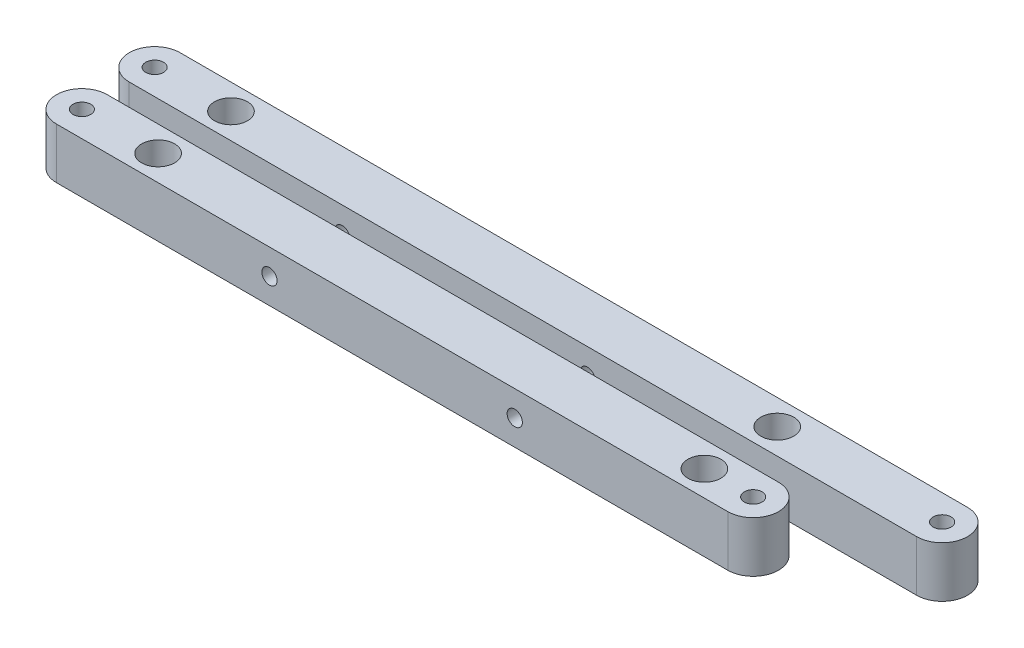
ISO-10303-21;
HEADER;
FILE_DESCRIPTION(('STEP AP214'),'2;1');
FILE_NAME('part.step','',(''),(''),'','','');
FILE_SCHEMA(('AUTOMOTIVE_DESIGN { 1 0 10303 214 1 1 1 1 }'));
ENDSEC;
DATA;
#1=APPLICATION_CONTEXT('core data for automotive mechanical design processes');
#2=APPLICATION_PROTOCOL_DEFINITION('international standard','automotive_design',2000,#1);
#3=PRODUCT_CONTEXT('',#1,'mechanical');
#4=PRODUCT('Part','Part','',(#3));
#5=PRODUCT_RELATED_PRODUCT_CATEGORY('part','',(#4));
#6=PRODUCT_DEFINITION_FORMATION('','',#4);
#7=PRODUCT_DEFINITION_CONTEXT('part definition',#1,'design');
#8=PRODUCT_DEFINITION('design','',#6,#7);
#9=PRODUCT_DEFINITION_SHAPE('','',#8);
#10=(LENGTH_UNIT() NAMED_UNIT(*) SI_UNIT(.MILLI.,.METRE.));
#11=(NAMED_UNIT(*) PLANE_ANGLE_UNIT() SI_UNIT($,.RADIAN.));
#12=(NAMED_UNIT(*) SI_UNIT($,.STERADIAN.) SOLID_ANGLE_UNIT());
#13=UNCERTAINTY_MEASURE_WITH_UNIT(LENGTH_MEASURE(1.E-05),#10,'distance_accuracy_value','');
#14=(GEOMETRIC_REPRESENTATION_CONTEXT(3) GLOBAL_UNCERTAINTY_ASSIGNED_CONTEXT((#13)) GLOBAL_UNIT_ASSIGNED_CONTEXT((#10,
#11,#12)) REPRESENTATION_CONTEXT('',''));
#15=CARTESIAN_POINT('',(0.,0.,0.));
#16=DIRECTION('',(0.,0.,1.));
#17=DIRECTION('',(1.,0.,0.));
#18=AXIS2_PLACEMENT_3D('',#15,#16,#17);
#19=CARTESIAN_POINT('',(31.9517119667802,10.,0.527341983870526));
#20=DIRECTION('',(0.,-1.,0.));
#21=DIRECTION('',(0.,0.,-1.));
#22=AXIS2_PLACEMENT_3D('',#19,#20,#21);
#23=CYLINDRICAL_SURFACE('',#22,1.75000000000001);
#24=CARTESIAN_POINT('',(31.9517119667802,0.,0.527341983870526));
#25=DIRECTION('',(0.,1.,0.));
#26=DIRECTION('',(0.,0.,1.));
#27=AXIS2_PLACEMENT_3D('',#24,#25,#26);
#28=CIRCLE('',#27,1.75000000000001);
#29=CARTESIAN_POINT('',(31.9517119667802,0.,2.27734198387054));
#30=VERTEX_POINT('',#29);
#31=EDGE_CURVE('E165',#30,#30,#28,.T.);
#32=ORIENTED_EDGE('',*,*,#31,.F.);
#33=EDGE_LOOP('',(#32));
#34=FACE_BOUND('',#33,.T.);
#35=CARTESIAN_POINT('',(31.9517119667802,2.,0.527341983870526));
#36=DIRECTION('',(0.,1.,0.));
#37=DIRECTION('',(0.,0.,1.));
#38=AXIS2_PLACEMENT_3D('',#35,#36,#37);
#39=CIRCLE('',#38,1.75000000000001);
#40=CARTESIAN_POINT('',(31.9517119667802,2.,2.27734198387054));
#41=VERTEX_POINT('',#40);
#42=EDGE_CURVE('E52',#41,#41,#39,.T.);
#43=ORIENTED_EDGE('',*,*,#42,.T.);
#44=EDGE_LOOP('',(#43));
#45=FACE_BOUND('',#44,.T.);
#46=ADVANCED_FACE('F48',(#34,#45),#23,.F.);
#47=CARTESIAN_POINT('',(139.43171196678,10.,0.527341983870526));
#48=DIRECTION('',(0.,-1.,0.));
#49=DIRECTION('',(0.,0.,-1.));
#50=AXIS2_PLACEMENT_3D('',#47,#48,#49);
#51=CYLINDRICAL_SURFACE('',#50,1.75000000000001);
#52=CARTESIAN_POINT('',(139.43171196678,0.,0.527341983870526));
#53=DIRECTION('',(0.,1.,0.));
#54=DIRECTION('',(0.,0.,1.));
#55=AXIS2_PLACEMENT_3D('',#52,#53,#54);
#56=CIRCLE('',#55,1.75000000000001);
#57=CARTESIAN_POINT('',(139.43171196678,0.,2.27734198387054));
#58=VERTEX_POINT('',#57);
#59=EDGE_CURVE('E160',#58,#58,#56,.T.);
#60=ORIENTED_EDGE('',*,*,#59,.F.);
#61=EDGE_LOOP('',(#60));
#62=FACE_BOUND('',#61,.T.);
#63=CARTESIAN_POINT('',(139.43171196678,2.,0.527341983870526));
#64=DIRECTION('',(0.,1.,0.));
#65=DIRECTION('',(0.,0.,1.));
#66=AXIS2_PLACEMENT_3D('',#63,#64,#65);
#67=CIRCLE('',#66,1.75000000000001);
#68=CARTESIAN_POINT('',(139.43171196678,2.,2.27734198387054));
#69=VERTEX_POINT('',#68);
#70=EDGE_CURVE('E132',#69,#69,#67,.T.);
#71=ORIENTED_EDGE('',*,*,#70,.T.);
#72=EDGE_LOOP('',(#71));
#73=FACE_BOUND('',#72,.T.);
#74=ADVANCED_FACE('F196',(#62,#73),#51,.F.);
#75=CARTESIAN_POINT('',(16.9517119667802,10.,0.527341983870526));
#76=DIRECTION('',(0.,1.,0.));
#77=DIRECTION('',(0.,0.,1.));
#78=AXIS2_PLACEMENT_3D('',#75,#76,#77);
#79=PLANE('',#78);
#80=CARTESIAN_POINT('',(31.9517119667802,10.,0.527341983870526));
#81=DIRECTION('',(0.,1.,0.));
#82=DIRECTION('',(0.,0.,1.));
#83=AXIS2_PLACEMENT_3D('',#80,#81,#82);
#84=CIRCLE('',#83,3.25);
#85=CARTESIAN_POINT('',(31.9517119667802,10.,3.77734198387053));
#86=VERTEX_POINT('',#85);
#87=EDGE_CURVE('E140',#86,#86,#84,.T.);
#88=ORIENTED_EDGE('',*,*,#87,.F.);
#89=EDGE_LOOP('',(#88));
#90=FACE_BOUND('',#89,.T.);
#91=CARTESIAN_POINT('',(139.43171196678,10.,0.527341983870526));
#92=DIRECTION('',(0.,1.,0.));
#93=DIRECTION('',(0.,0.,1.));
#94=AXIS2_PLACEMENT_3D('',#91,#92,#93);
#95=CIRCLE('',#94,3.25000000000001);
#96=CARTESIAN_POINT('',(139.43171196678,10.,3.77734198387053));
#97=VERTEX_POINT('',#96);
#98=EDGE_CURVE('E150',#97,#97,#95,.T.);
#99=ORIENTED_EDGE('',*,*,#98,.F.);
#100=EDGE_LOOP('',(#99));
#101=FACE_BOUND('',#100,.T.);
#102=CARTESIAN_POINT('',(16.9517119667802,10.,0.527341983870526));
#103=DIRECTION('',(0.,1.,0.));
#104=DIRECTION('',(0.,0.,1.));
#105=AXIS2_PLACEMENT_3D('',#102,#103,#104);
#106=CIRCLE('',#105,1.75000000000001);
#107=CARTESIAN_POINT('',(16.9517119667802,10.,2.27734198387053));
#108=VERTEX_POINT('',#107);
#109=EDGE_CURVE('E119',#108,#108,#106,.T.);
#110=ORIENTED_EDGE('',*,*,#109,.F.);
#111=EDGE_LOOP('',(#110));
#112=FACE_BOUND('',#111,.T.);
#113=CARTESIAN_POINT('',(16.9517119667802,10.,0.527341983870526));
#114=DIRECTION('',(0.,1.,0.));
#115=DIRECTION('',(0.,0.,1.));
#116=AXIS2_PLACEMENT_3D('',#113,#114,#115);
#117=CIRCLE('',#116,5.);
#118=CARTESIAN_POINT('',(16.9517119667802,10.,-4.47265801612947));
#119=VERTEX_POINT('',#118);
#120=CARTESIAN_POINT('',(16.9517119667802,10.,5.52734198387053));
#121=VERTEX_POINT('',#120);
#122=EDGE_CURVE('E103',#119,#121,#117,.T.);
#123=ORIENTED_EDGE('',*,*,#122,.T.);
#124=DIRECTION('',(1.,0.,0.));
#125=VECTOR('',#124,1.);
#126=CARTESIAN_POINT('',(149.03171196678,10.,5.52734198387053));
#127=LINE('',#126,#125);
#128=CARTESIAN_POINT('',(149.03171196678,10.,5.52734198387053));
#129=VERTEX_POINT('',#128);
#130=EDGE_CURVE('E97',#121,#129,#127,.T.);
#131=ORIENTED_EDGE('',*,*,#130,.T.);
#132=CARTESIAN_POINT('',(149.03171196678,10.,0.527341983870526));
#133=DIRECTION('',(0.,1.,0.));
#134=DIRECTION('',(0.,0.,-1.));
#135=AXIS2_PLACEMENT_3D('',#132,#133,#134);
#136=CIRCLE('',#135,5.);
#137=CARTESIAN_POINT('',(149.031711966781,10.,-4.47265801612947));
#138=VERTEX_POINT('',#137);
#139=EDGE_CURVE('E101',#129,#138,#136,.T.);
#140=ORIENTED_EDGE('',*,*,#139,.T.);
#141=DIRECTION('',(-1.,0.,0.));
#142=VECTOR('',#141,1.);
#143=CARTESIAN_POINT('',(16.9517119667802,10.,-4.47265801612947));
#144=LINE('',#143,#142);
#145=EDGE_CURVE('E67',#138,#119,#144,.T.);
#146=ORIENTED_EDGE('',*,*,#145,.T.);
#147=EDGE_LOOP('',(#123,#131,#140,#146));
#148=FACE_BOUND('',#147,.T.);
#149=CARTESIAN_POINT('',(149.03171196678,10.,0.527341983870526));
#150=DIRECTION('',(0.,1.,0.));
#151=DIRECTION('',(0.,0.,1.));
#152=AXIS2_PLACEMENT_3D('',#149,#150,#151);
#153=CIRCLE('',#152,1.75000000000001);
#154=CARTESIAN_POINT('',(149.03171196678,10.,2.27734198387054));
#155=VERTEX_POINT('',#154);
#156=EDGE_CURVE('E157',#155,#155,#153,.T.);
#157=ORIENTED_EDGE('',*,*,#156,.F.);
#158=EDGE_LOOP('',(#157));
#159=FACE_BOUND('',#158,.T.);
#160=ADVANCED_FACE('F98',(#90,#101,#112,#148,#159),#79,.T.);
#161=CARTESIAN_POINT('',(16.9517119667802,0.,0.527341983870526));
#162=DIRECTION('',(0.,1.,0.));
#163=DIRECTION('',(0.,0.,1.));
#164=AXIS2_PLACEMENT_3D('',#161,#162,#163);
#165=PLANE('',#164);
#166=CARTESIAN_POINT('',(16.9517119667802,0.,0.527341983870526));
#167=DIRECTION('',(0.,1.,0.));
#168=DIRECTION('',(0.,0.,1.));
#169=AXIS2_PLACEMENT_3D('',#166,#167,#168);
#170=CIRCLE('',#169,5.);
#171=CARTESIAN_POINT('',(16.9517119667802,0.,-4.47265801612947));
#172=VERTEX_POINT('',#171);
#173=CARTESIAN_POINT('',(16.9517119667802,0.,5.52734198387053));
#174=VERTEX_POINT('',#173);
#175=EDGE_CURVE('E116',#172,#174,#170,.T.);
#176=ORIENTED_EDGE('',*,*,#175,.F.);
#177=DIRECTION('',(-1.,0.,0.));
#178=VECTOR('',#177,1.);
#179=CARTESIAN_POINT('',(16.9517119667802,0.,-4.47265801612947));
#180=LINE('',#179,#178);
#181=CARTESIAN_POINT('',(149.031711966781,0.,-4.47265801612947));
#182=VERTEX_POINT('',#181);
#183=EDGE_CURVE('E90',#182,#172,#180,.T.);
#184=ORIENTED_EDGE('',*,*,#183,.F.);
#185=CARTESIAN_POINT('',(149.03171196678,0.,0.527341983870526));
#186=DIRECTION('',(0.,1.,0.));
#187=DIRECTION('',(0.,0.,-1.));
#188=AXIS2_PLACEMENT_3D('',#185,#186,#187);
#189=CIRCLE('',#188,5.);
#190=CARTESIAN_POINT('',(149.03171196678,0.,5.52734198387053));
#191=VERTEX_POINT('',#190);
#192=EDGE_CURVE('E84',#191,#182,#189,.T.);
#193=ORIENTED_EDGE('',*,*,#192,.F.);
#194=DIRECTION('',(1.,0.,0.));
#195=VECTOR('',#194,1.);
#196=CARTESIAN_POINT('',(149.03171196678,0.,5.52734198387053));
#197=LINE('',#196,#195);
#198=EDGE_CURVE('E107',#174,#191,#197,.T.);
#199=ORIENTED_EDGE('',*,*,#198,.F.);
#200=EDGE_LOOP('',(#176,#184,#193,#199));
#201=FACE_BOUND('',#200,.T.);
#202=CARTESIAN_POINT('',(16.9517119667802,0.,0.527341983870526));
#203=DIRECTION('',(0.,1.,0.));
#204=DIRECTION('',(0.,0.,1.));
#205=AXIS2_PLACEMENT_3D('',#202,#203,#204);
#206=CIRCLE('',#205,1.75000000000001);
#207=CARTESIAN_POINT('',(16.9517119667802,0.,2.27734198387053));
#208=VERTEX_POINT('',#207);
#209=EDGE_CURVE('E168',#208,#208,#206,.T.);
#210=ORIENTED_EDGE('',*,*,#209,.T.);
#211=EDGE_LOOP('',(#210));
#212=FACE_BOUND('',#211,.T.);
#213=ORIENTED_EDGE('',*,*,#31,.T.);
#214=EDGE_LOOP('',(#213));
#215=FACE_BOUND('',#214,.T.);
#216=ORIENTED_EDGE('',*,*,#59,.T.);
#217=EDGE_LOOP('',(#216));
#218=FACE_BOUND('',#217,.T.);
#219=CARTESIAN_POINT('',(149.03171196678,0.,0.527341983870526));
#220=DIRECTION('',(0.,1.,0.));
#221=DIRECTION('',(0.,0.,1.));
#222=AXIS2_PLACEMENT_3D('',#219,#220,#221);
#223=CIRCLE('',#222,1.75000000000001);
#224=CARTESIAN_POINT('',(149.03171196678,0.,2.27734198387054));
#225=VERTEX_POINT('',#224);
#226=EDGE_CURVE('E131',#225,#225,#223,.T.);
#227=ORIENTED_EDGE('',*,*,#226,.T.);
#228=EDGE_LOOP('',(#227));
#229=FACE_BOUND('',#228,.T.);
#230=ADVANCED_FACE('F174',(#201,#212,#215,#218,#229),#165,.F.);
#231=CARTESIAN_POINT('',(16.9517119667802,10.,0.527341983870526));
#232=DIRECTION('',(0.,-1.,0.));
#233=DIRECTION('',(0.,0.,-1.));
#234=AXIS2_PLACEMENT_3D('',#231,#232,#233);
#235=CYLINDRICAL_SURFACE('',#234,5.);
#236=ORIENTED_EDGE('',*,*,#175,.T.);
#237=DIRECTION('',(0.,-1.,0.));
#238=VECTOR('',#237,1.);
#239=CARTESIAN_POINT('',(16.9517119667802,10.,5.52734198387053));
#240=LINE('',#239,#238);
#241=EDGE_CURVE('E12',#121,#174,#240,.T.);
#242=ORIENTED_EDGE('',*,*,#241,.F.);
#243=ORIENTED_EDGE('',*,*,#122,.F.);
#244=DIRECTION('',(0.,-1.,0.));
#245=VECTOR('',#244,1.);
#246=CARTESIAN_POINT('',(16.9517119667802,10.,-4.47265801612947));
#247=LINE('',#246,#245);
#248=EDGE_CURVE('E112',#119,#172,#247,.T.);
#249=ORIENTED_EDGE('',*,*,#248,.T.);
#250=EDGE_LOOP('',(#236,#242,#243,#249));
#251=FACE_BOUND('',#250,.T.);
#252=ADVANCED_FACE('F50',(#251),#235,.T.);
#253=CARTESIAN_POINT('',(149.03171196678,10.,5.52734198387053));
#254=DIRECTION('',(0.,0.,-1.));
#255=DIRECTION('',(-1.,0.,0.));
#256=AXIS2_PLACEMENT_3D('',#253,#254,#255);
#257=PLANE('',#256);
#258=CARTESIAN_POINT('',(58.86171196678,5.,5.52734198387053));
#259=DIRECTION('',(0.,0.,1.));
#260=DIRECTION('',(1.,0.,0.));
#261=AXIS2_PLACEMENT_3D('',#258,#259,#260);
#262=CIRCLE('',#261,1.5);
#263=CARTESIAN_POINT('',(60.36171196678,5.,5.52734198387053));
#264=VERTEX_POINT('',#263);
#265=EDGE_CURVE('E129',#264,#264,#262,.T.);
#266=ORIENTED_EDGE('',*,*,#265,.F.);
#267=EDGE_LOOP('',(#266));
#268=FACE_BOUND('',#267,.T.);
#269=CARTESIAN_POINT('',(107.12171196678,5.00000000000001,5.52734198387053));
#270=DIRECTION('',(0.,0.,1.));
#271=DIRECTION('',(1.,0.,0.));
#272=AXIS2_PLACEMENT_3D('',#269,#270,#271);
#273=CIRCLE('',#272,1.5);
#274=CARTESIAN_POINT('',(108.62171196678,5.00000000000001,5.52734198387053));
#275=VERTEX_POINT('',#274);
#276=EDGE_CURVE('E138',#275,#275,#273,.T.);
#277=ORIENTED_EDGE('',*,*,#276,.F.);
#278=EDGE_LOOP('',(#277));
#279=FACE_BOUND('',#278,.T.);
#280=ORIENTED_EDGE('',*,*,#198,.T.);
#281=DIRECTION('',(0.,-1.,0.));
#282=VECTOR('',#281,1.);
#283=CARTESIAN_POINT('',(149.03171196678,10.,5.52734198387053));
#284=LINE('',#283,#282);
#285=EDGE_CURVE('E58',#129,#191,#284,.T.);
#286=ORIENTED_EDGE('',*,*,#285,.F.);
#287=ORIENTED_EDGE('',*,*,#130,.F.);
#288=ORIENTED_EDGE('',*,*,#241,.T.);
#289=EDGE_LOOP('',(#280,#286,#287,#288));
#290=FACE_BOUND('',#289,.T.);
#291=ADVANCED_FACE('F106',(#268,#279,#290),#257,.F.);
#292=CARTESIAN_POINT('',(149.03171196678,10.,0.527341983870526));
#293=DIRECTION('',(0.,-1.,0.));
#294=DIRECTION('',(0.,0.,-1.));
#295=AXIS2_PLACEMENT_3D('',#292,#293,#294);
#296=CYLINDRICAL_SURFACE('',#295,5.);
#297=ORIENTED_EDGE('',*,*,#192,.T.);
#298=DIRECTION('',(0.,-1.,0.));
#299=VECTOR('',#298,1.);
#300=CARTESIAN_POINT('',(149.031711966781,10.,-4.47265801612947));
#301=LINE('',#300,#299);
#302=EDGE_CURVE('E108',#138,#182,#301,.T.);
#303=ORIENTED_EDGE('',*,*,#302,.F.);
#304=ORIENTED_EDGE('',*,*,#139,.F.);
#305=ORIENTED_EDGE('',*,*,#285,.T.);
#306=EDGE_LOOP('',(#297,#303,#304,#305));
#307=FACE_BOUND('',#306,.T.);
#308=ADVANCED_FACE('F110',(#307),#296,.T.);
#309=CARTESIAN_POINT('',(16.9517119667802,10.,-4.47265801612947));
#310=DIRECTION('',(0.,0.,1.));
#311=DIRECTION('',(1.,0.,0.));
#312=AXIS2_PLACEMENT_3D('',#309,#310,#311);
#313=PLANE('',#312);
#314=CARTESIAN_POINT('',(58.86171196678,5.,-4.47265801612947));
#315=DIRECTION('',(0.,0.,1.));
#316=DIRECTION('',(1.,0.,0.));
#317=AXIS2_PLACEMENT_3D('',#314,#315,#316);
#318=CIRCLE('',#317,1.5);
#319=CARTESIAN_POINT('',(60.36171196678,5.,-4.47265801612947));
#320=VERTEX_POINT('',#319);
#321=EDGE_CURVE('E128',#320,#320,#318,.T.);
#322=ORIENTED_EDGE('',*,*,#321,.T.);
#323=EDGE_LOOP('',(#322));
#324=FACE_BOUND('',#323,.T.);
#325=CARTESIAN_POINT('',(107.12171196678,5.00000000000001,-4.47265801612947));
#326=DIRECTION('',(0.,0.,1.));
#327=DIRECTION('',(1.,0.,0.));
#328=AXIS2_PLACEMENT_3D('',#325,#326,#327);
#329=CIRCLE('',#328,1.5);
#330=CARTESIAN_POINT('',(108.62171196678,5.00000000000001,-4.47265801612947));
#331=VERTEX_POINT('',#330);
#332=EDGE_CURVE('E125',#331,#331,#329,.T.);
#333=ORIENTED_EDGE('',*,*,#332,.T.);
#334=EDGE_LOOP('',(#333));
#335=FACE_BOUND('',#334,.T.);
#336=ORIENTED_EDGE('',*,*,#183,.T.);
#337=ORIENTED_EDGE('',*,*,#248,.F.);
#338=ORIENTED_EDGE('',*,*,#145,.F.);
#339=ORIENTED_EDGE('',*,*,#302,.T.);
#340=EDGE_LOOP('',(#336,#337,#338,#339));
#341=FACE_BOUND('',#340,.T.);
#342=ADVANCED_FACE('F180',(#324,#335,#341),#313,.F.);
#343=CARTESIAN_POINT('',(16.9517119667802,10.,0.527341983870526));
#344=DIRECTION('',(0.,-1.,0.));
#345=DIRECTION('',(0.,0.,-1.));
#346=AXIS2_PLACEMENT_3D('',#343,#344,#345);
#347=CYLINDRICAL_SURFACE('',#346,1.75000000000001);
#348=ORIENTED_EDGE('',*,*,#109,.T.);
#349=EDGE_LOOP('',(#348));
#350=FACE_BOUND('',#349,.T.);
#351=ORIENTED_EDGE('',*,*,#209,.F.);
#352=EDGE_LOOP('',(#351));
#353=FACE_BOUND('',#352,.T.);
#354=ADVANCED_FACE('F177',(#350,#353),#347,.F.);
#355=CARTESIAN_POINT('',(149.03171196678,10.,0.527341983870526));
#356=DIRECTION('',(0.,-1.,0.));
#357=DIRECTION('',(0.,0.,-1.));
#358=AXIS2_PLACEMENT_3D('',#355,#356,#357);
#359=CYLINDRICAL_SURFACE('',#358,1.75000000000001);
#360=ORIENTED_EDGE('',*,*,#156,.T.);
#361=EDGE_LOOP('',(#360));
#362=FACE_BOUND('',#361,.T.);
#363=ORIENTED_EDGE('',*,*,#226,.F.);
#364=EDGE_LOOP('',(#363));
#365=FACE_BOUND('',#364,.T.);
#366=ADVANCED_FACE('F179',(#362,#365),#359,.F.);
#367=CARTESIAN_POINT('',(107.12171196678,5.00000000000001,-18.7915450649919));
#368=DIRECTION('',(0.,0.,1.));
#369=DIRECTION('',(1.,0.,0.));
#370=AXIS2_PLACEMENT_3D('',#367,#368,#369);
#371=CYLINDRICAL_SURFACE('',#370,1.5);
#372=ORIENTED_EDGE('',*,*,#276,.T.);
#373=EDGE_LOOP('',(#372));
#374=FACE_BOUND('',#373,.T.);
#375=ORIENTED_EDGE('',*,*,#332,.F.);
#376=EDGE_LOOP('',(#375));
#377=FACE_BOUND('',#376,.T.);
#378=ADVANCED_FACE('F187',(#374,#377),#371,.F.);
#379=CARTESIAN_POINT('',(58.86171196678,5.,-18.7915450649919));
#380=DIRECTION('',(0.,0.,1.));
#381=DIRECTION('',(1.,0.,0.));
#382=AXIS2_PLACEMENT_3D('',#379,#380,#381);
#383=CYLINDRICAL_SURFACE('',#382,1.5);
#384=ORIENTED_EDGE('',*,*,#265,.T.);
#385=EDGE_LOOP('',(#384));
#386=FACE_BOUND('',#385,.T.);
#387=ORIENTED_EDGE('',*,*,#321,.F.);
#388=EDGE_LOOP('',(#387));
#389=FACE_BOUND('',#388,.T.);
#390=ADVANCED_FACE('F209',(#386,#389),#383,.F.);
#391=CARTESIAN_POINT('',(139.43171196678,2.,0.527341983870526));
#392=DIRECTION('',(0.,1.,0.));
#393=DIRECTION('',(0.,0.,1.));
#394=AXIS2_PLACEMENT_3D('',#391,#392,#393);
#395=CYLINDRICAL_SURFACE('',#394,3.25000000000001);
#396=CARTESIAN_POINT('',(139.43171196678,2.,0.527341983870526));
#397=DIRECTION('',(0.,1.,0.));
#398=DIRECTION('',(0.,0.,1.));
#399=AXIS2_PLACEMENT_3D('',#396,#397,#398);
#400=CIRCLE('',#399,3.25000000000001);
#401=CARTESIAN_POINT('',(139.43171196678,2.,3.77734198387053));
#402=VERTEX_POINT('',#401);
#403=EDGE_CURVE('E145',#402,#402,#400,.T.);
#404=ORIENTED_EDGE('',*,*,#403,.F.);
#405=EDGE_LOOP('',(#404));
#406=FACE_BOUND('',#405,.T.);
#407=ORIENTED_EDGE('',*,*,#98,.T.);
#408=EDGE_LOOP('',(#407));
#409=FACE_BOUND('',#408,.T.);
#410=ADVANCED_FACE('F213',(#406,#409),#395,.F.);
#411=CARTESIAN_POINT('',(139.43171196678,2.,0.527341983870526));
#412=DIRECTION('',(0.,1.,0.));
#413=DIRECTION('',(0.,0.,1.));
#414=AXIS2_PLACEMENT_3D('',#411,#412,#413);
#415=PLANE('',#414);
#416=ORIENTED_EDGE('',*,*,#70,.F.);
#417=EDGE_LOOP('',(#416));
#418=FACE_BOUND('',#417,.T.);
#419=ORIENTED_EDGE('',*,*,#403,.T.);
#420=EDGE_LOOP('',(#419));
#421=FACE_BOUND('',#420,.T.);
#422=ADVANCED_FACE('F217',(#418,#421),#415,.T.);
#423=CARTESIAN_POINT('',(31.9517119667802,2.,0.527341983870526));
#424=DIRECTION('',(0.,1.,0.));
#425=DIRECTION('',(0.,0.,1.));
#426=AXIS2_PLACEMENT_3D('',#423,#424,#425);
#427=CYLINDRICAL_SURFACE('',#426,3.25);
#428=CARTESIAN_POINT('',(31.9517119667802,2.,0.527341983870526));
#429=DIRECTION('',(0.,1.,0.));
#430=DIRECTION('',(0.,0.,1.));
#431=AXIS2_PLACEMENT_3D('',#428,#429,#430);
#432=CIRCLE('',#431,3.25);
#433=CARTESIAN_POINT('',(31.9517119667802,2.,3.77734198387053));
#434=VERTEX_POINT('',#433);
#435=EDGE_CURVE('E134',#434,#434,#432,.T.);
#436=ORIENTED_EDGE('',*,*,#435,.F.);
#437=EDGE_LOOP('',(#436));
#438=FACE_BOUND('',#437,.T.);
#439=ORIENTED_EDGE('',*,*,#87,.T.);
#440=EDGE_LOOP('',(#439));
#441=FACE_BOUND('',#440,.T.);
#442=ADVANCED_FACE('F221',(#438,#441),#427,.F.);
#443=CARTESIAN_POINT('',(31.9517119667802,2.,0.527341983870526));
#444=DIRECTION('',(0.,1.,0.));
#445=DIRECTION('',(0.,0.,1.));
#446=AXIS2_PLACEMENT_3D('',#443,#444,#445);
#447=PLANE('',#446);
#448=ORIENTED_EDGE('',*,*,#42,.F.);
#449=EDGE_LOOP('',(#448));
#450=FACE_BOUND('',#449,.T.);
#451=ORIENTED_EDGE('',*,*,#435,.T.);
#452=EDGE_LOOP('',(#451));
#453=FACE_BOUND('',#452,.T.);
#454=ADVANCED_FACE('F225',(#450,#453),#447,.T.);
#455=CLOSED_SHELL('',(#46,#74,#160,#230,#252,#291,#308,#342,#354,#366,#378,#390,#410,#422,#442,#454));
#456=MANIFOLD_SOLID_BREP('B2',#455);
#457=CARTESIAN_POINT('',(31.9517119667803,10.,-13.8102971641873));
#458=DIRECTION('',(0.,-1.,0.));
#459=DIRECTION('',(0.,0.,-1.));
#460=AXIS2_PLACEMENT_3D('',#457,#458,#459);
#461=CYLINDRICAL_SURFACE('',#460,1.75000000000001);
#462=CARTESIAN_POINT('',(31.9517119667803,0.,-13.8102971641873));
#463=DIRECTION('',(0.,1.,0.));
#464=DIRECTION('',(0.,0.,1.));
#465=AXIS2_PLACEMENT_3D('',#462,#463,#464);
#466=CIRCLE('',#465,1.75000000000001);
#467=CARTESIAN_POINT('',(31.9517119667803,0.,-12.0602971641872));
#468=VERTEX_POINT('',#467);
#469=EDGE_CURVE('E498',#468,#468,#466,.T.);
#470=ORIENTED_EDGE('',*,*,#469,.F.);
#471=EDGE_LOOP('',(#470));
#472=FACE_BOUND('',#471,.T.);
#473=CARTESIAN_POINT('',(31.9517119667803,2.,-13.8102971641873));
#474=DIRECTION('',(0.,1.,0.));
#475=DIRECTION('',(0.,0.,1.));
#476=AXIS2_PLACEMENT_3D('',#473,#474,#475);
#477=CIRCLE('',#476,1.75000000000001);
#478=CARTESIAN_POINT('',(31.9517119667803,2.,-12.0602971641872));
#479=VERTEX_POINT('',#478);
#480=EDGE_CURVE('E361',#479,#479,#477,.T.);
#481=ORIENTED_EDGE('',*,*,#480,.T.);
#482=EDGE_LOOP('',(#481));
#483=FACE_BOUND('',#482,.T.);
#484=ADVANCED_FACE('F357',(#472,#483),#461,.F.);
#485=CARTESIAN_POINT('',(139.43171196678,10.,-13.8102971641873));
#486=DIRECTION('',(0.,-1.,0.));
#487=DIRECTION('',(0.,0.,-1.));
#488=AXIS2_PLACEMENT_3D('',#485,#486,#487);
#489=CYLINDRICAL_SURFACE('',#488,1.75000000000001);
#490=CARTESIAN_POINT('',(139.43171196678,0.,-13.8102971641873));
#491=DIRECTION('',(0.,1.,0.));
#492=DIRECTION('',(0.,0.,1.));
#493=AXIS2_PLACEMENT_3D('',#490,#491,#492);
#494=CIRCLE('',#493,1.75000000000001);
#495=CARTESIAN_POINT('',(139.43171196678,0.,-12.0602971641873));
#496=VERTEX_POINT('',#495);
#497=EDGE_CURVE('E491',#496,#496,#494,.T.);
#498=ORIENTED_EDGE('',*,*,#497,.F.);
#499=EDGE_LOOP('',(#498));
#500=FACE_BOUND('',#499,.T.);
#501=CARTESIAN_POINT('',(139.43171196678,2.,-13.8102971641873));
#502=DIRECTION('',(0.,1.,0.));
#503=DIRECTION('',(0.,0.,1.));
#504=AXIS2_PLACEMENT_3D('',#501,#502,#503);
#505=CIRCLE('',#504,1.75000000000001);
#506=CARTESIAN_POINT('',(139.43171196678,2.,-12.0602971641873));
#507=VERTEX_POINT('',#506);
#508=EDGE_CURVE('E444',#507,#507,#505,.T.);
#509=ORIENTED_EDGE('',*,*,#508,.T.);
#510=EDGE_LOOP('',(#509));
#511=FACE_BOUND('',#510,.T.);
#512=ADVANCED_FACE('F533',(#500,#511),#489,.F.);
#513=CARTESIAN_POINT('',(16.9517119667803,10.,-13.7915450649919));
#514=DIRECTION('',(0.,1.,0.));
#515=DIRECTION('',(0.,0.,1.));
#516=AXIS2_PLACEMENT_3D('',#513,#514,#515);
#517=PLANE('',#516);
#518=CARTESIAN_POINT('',(31.9517119667803,10.,-13.8102971641873));
#519=DIRECTION('',(0.,1.,0.));
#520=DIRECTION('',(0.,0.,1.));
#521=AXIS2_PLACEMENT_3D('',#518,#519,#520);
#522=CIRCLE('',#521,3.25);
#523=CARTESIAN_POINT('',(31.9517119667803,10.,-10.5602971641873));
#524=VERTEX_POINT('',#523);
#525=EDGE_CURVE('E455',#524,#524,#522,.T.);
#526=ORIENTED_EDGE('',*,*,#525,.F.);
#527=EDGE_LOOP('',(#526));
#528=FACE_BOUND('',#527,.T.);
#529=CARTESIAN_POINT('',(139.43171196678,10.,-13.8102971641873));
#530=DIRECTION('',(0.,1.,0.));
#531=DIRECTION('',(0.,0.,1.));
#532=AXIS2_PLACEMENT_3D('',#529,#530,#531);
#533=CIRCLE('',#532,3.25000000000001);
#534=CARTESIAN_POINT('',(139.43171196678,10.,-10.5602971641873));
#535=VERTEX_POINT('',#534);
#536=EDGE_CURVE('E467',#535,#535,#533,.T.);
#537=ORIENTED_EDGE('',*,*,#536,.F.);
#538=EDGE_LOOP('',(#537));
#539=FACE_BOUND('',#538,.T.);
#540=CARTESIAN_POINT('',(16.9517119667803,10.,-13.7915450649919));
#541=DIRECTION('',(0.,1.,0.));
#542=DIRECTION('',(0.,0.,1.));
#543=AXIS2_PLACEMENT_3D('',#540,#541,#542);
#544=CIRCLE('',#543,1.75);
#545=CARTESIAN_POINT('',(16.9517119667803,10.,-12.0415450649919));
#546=VERTEX_POINT('',#545);
#547=EDGE_CURVE('E434',#546,#546,#544,.T.);
#548=ORIENTED_EDGE('',*,*,#547,.F.);
#549=EDGE_LOOP('',(#548));
#550=FACE_BOUND('',#549,.T.);
#551=CARTESIAN_POINT('',(16.9517119667803,10.,-13.7915450649919));
#552=DIRECTION('',(0.,1.,0.));
#553=DIRECTION('',(0.,0.,1.));
#554=AXIS2_PLACEMENT_3D('',#551,#552,#553);
#555=CIRCLE('',#554,5.);
#556=CARTESIAN_POINT('',(16.9517119667803,10.,-18.7915450649919));
#557=VERTEX_POINT('',#556);
#558=CARTESIAN_POINT('',(16.9517119667803,10.,-8.79154506499192));
#559=VERTEX_POINT('',#558);
#560=EDGE_CURVE('E413',#557,#559,#555,.T.);
#561=ORIENTED_EDGE('',*,*,#560,.T.);
#562=DIRECTION('',(1.,0.,0.));
#563=VECTOR('',#562,1.);
#564=CARTESIAN_POINT('',(171.89171196678,10.,-8.79154506499192));
#565=LINE('',#564,#563);
#566=CARTESIAN_POINT('',(171.89171196678,10.,-8.79154506499192));
#567=VERTEX_POINT('',#566);
#568=EDGE_CURVE('E407',#559,#567,#565,.T.);
#569=ORIENTED_EDGE('',*,*,#568,.T.);
#570=CARTESIAN_POINT('',(171.89171196678,10.,-13.7915450649919));
#571=DIRECTION('',(0.,1.,0.));
#572=DIRECTION('',(0.,0.,-1.));
#573=AXIS2_PLACEMENT_3D('',#570,#571,#572);
#574=CIRCLE('',#573,5.);
#575=CARTESIAN_POINT('',(171.89171196678,10.,-18.7915450649919));
#576=VERTEX_POINT('',#575);
#577=EDGE_CURVE('E411',#567,#576,#574,.T.);
#578=ORIENTED_EDGE('',*,*,#577,.T.);
#579=DIRECTION('',(-1.,0.,0.));
#580=VECTOR('',#579,1.);
#581=CARTESIAN_POINT('',(16.9517119667803,10.,-18.7915450649919));
#582=LINE('',#581,#580);
#583=EDGE_CURVE('E377',#576,#557,#582,.T.);
#584=ORIENTED_EDGE('',*,*,#583,.T.);
#585=EDGE_LOOP('',(#561,#569,#578,#584));
#586=FACE_BOUND('',#585,.T.);
#587=CARTESIAN_POINT('',(171.89171196678,10.,-13.7915450649919));
#588=DIRECTION('',(0.,1.,0.));
#589=DIRECTION('',(0.,0.,1.));
#590=AXIS2_PLACEMENT_3D('',#587,#588,#589);
#591=CIRCLE('',#590,1.75000000000001);
#592=CARTESIAN_POINT('',(171.89171196678,10.,-12.0415450649919));
#593=VERTEX_POINT('',#592);
#594=EDGE_CURVE('E487',#593,#593,#591,.T.);
#595=ORIENTED_EDGE('',*,*,#594,.F.);
#596=EDGE_LOOP('',(#595));
#597=FACE_BOUND('',#596,.T.);
#598=ADVANCED_FACE('F408',(#528,#539,#550,#586,#597),#517,.T.);
#599=CARTESIAN_POINT('',(16.9517119667803,0.,-13.7915450649919));
#600=DIRECTION('',(0.,1.,0.));
#601=DIRECTION('',(0.,0.,1.));
#602=AXIS2_PLACEMENT_3D('',#599,#600,#601);
#603=PLANE('',#602);
#604=CARTESIAN_POINT('',(16.9517119667803,0.,-13.7915450649919));
#605=DIRECTION('',(0.,1.,0.));
#606=DIRECTION('',(0.,0.,1.));
#607=AXIS2_PLACEMENT_3D('',#604,#605,#606);
#608=CIRCLE('',#607,5.);
#609=CARTESIAN_POINT('',(16.9517119667803,0.,-18.7915450649919));
#610=VERTEX_POINT('',#609);
#611=CARTESIAN_POINT('',(16.9517119667803,0.,-8.79154506499192));
#612=VERTEX_POINT('',#611);
#613=EDGE_CURVE('E430',#610,#612,#608,.T.);
#614=ORIENTED_EDGE('',*,*,#613,.F.);
#615=DIRECTION('',(-1.,0.,0.));
#616=VECTOR('',#615,1.);
#617=CARTESIAN_POINT('',(16.9517119667803,0.,-18.7915450649919));
#618=LINE('',#617,#616);
#619=CARTESIAN_POINT('',(171.89171196678,0.,-18.7915450649919));
#620=VERTEX_POINT('',#619);
#621=EDGE_CURVE('E400',#620,#610,#618,.T.);
#622=ORIENTED_EDGE('',*,*,#621,.F.);
#623=CARTESIAN_POINT('',(171.89171196678,0.,-13.7915450649919));
#624=DIRECTION('',(0.,1.,0.));
#625=DIRECTION('',(0.,0.,-1.));
#626=AXIS2_PLACEMENT_3D('',#623,#624,#625);
#627=CIRCLE('',#626,5.);
#628=CARTESIAN_POINT('',(171.89171196678,0.,-8.79154506499192));
#629=VERTEX_POINT('',#628);
#630=EDGE_CURVE('E394',#629,#620,#627,.T.);
#631=ORIENTED_EDGE('',*,*,#630,.F.);
#632=DIRECTION('',(1.,0.,0.));
#633=VECTOR('',#632,1.);
#634=CARTESIAN_POINT('',(171.89171196678,0.,-8.79154506499192));
#635=LINE('',#634,#633);
#636=EDGE_CURVE('E418',#612,#629,#635,.T.);
#637=ORIENTED_EDGE('',*,*,#636,.F.);
#638=EDGE_LOOP('',(#614,#622,#631,#637));
#639=FACE_BOUND('',#638,.T.);
#640=CARTESIAN_POINT('',(16.9517119667803,0.,-13.7915450649919));
#641=DIRECTION('',(0.,1.,0.));
#642=DIRECTION('',(0.,0.,1.));
#643=AXIS2_PLACEMENT_3D('',#640,#641,#642);
#644=CIRCLE('',#643,1.75);
#645=CARTESIAN_POINT('',(16.9517119667803,0.,-12.0415450649919));
#646=VERTEX_POINT('',#645);
#647=EDGE_CURVE('E502',#646,#646,#644,.T.);
#648=ORIENTED_EDGE('',*,*,#647,.T.);
#649=EDGE_LOOP('',(#648));
#650=FACE_BOUND('',#649,.T.);
#651=ORIENTED_EDGE('',*,*,#469,.T.);
#652=EDGE_LOOP('',(#651));
#653=FACE_BOUND('',#652,.T.);
#654=ORIENTED_EDGE('',*,*,#497,.T.);
#655=EDGE_LOOP('',(#654));
#656=FACE_BOUND('',#655,.T.);
#657=CARTESIAN_POINT('',(171.89171196678,0.,-13.7915450649919));
#658=DIRECTION('',(0.,1.,0.));
#659=DIRECTION('',(0.,0.,1.));
#660=AXIS2_PLACEMENT_3D('',#657,#658,#659);
#661=CIRCLE('',#660,1.75000000000001);
#662=CARTESIAN_POINT('',(171.89171196678,0.,-12.0415450649919));
#663=VERTEX_POINT('',#662);
#664=EDGE_CURVE('E486',#663,#663,#661,.T.);
#665=ORIENTED_EDGE('',*,*,#664,.T.);
#666=EDGE_LOOP('',(#665));
#667=FACE_BOUND('',#666,.T.);
#668=ADVANCED_FACE('F511',(#639,#650,#653,#656,#667),#603,.F.);
#669=CARTESIAN_POINT('',(16.9517119667803,10.,-13.7915450649919));
#670=DIRECTION('',(0.,-1.,0.));
#671=DIRECTION('',(0.,0.,-1.));
#672=AXIS2_PLACEMENT_3D('',#669,#670,#671);
#673=CYLINDRICAL_SURFACE('',#672,5.);
#674=ORIENTED_EDGE('',*,*,#613,.T.);
#675=DIRECTION('',(0.,-1.,0.));
#676=VECTOR('',#675,1.);
#677=CARTESIAN_POINT('',(16.9517119667803,10.,-8.79154506499192));
#678=LINE('',#677,#676);
#679=EDGE_CURVE('E46',#559,#612,#678,.T.);
#680=ORIENTED_EDGE('',*,*,#679,.F.);
#681=ORIENTED_EDGE('',*,*,#560,.F.);
#682=DIRECTION('',(0.,-1.,0.));
#683=VECTOR('',#682,1.);
#684=CARTESIAN_POINT('',(16.9517119667803,10.,-18.7915450649919));
#685=LINE('',#684,#683);
#686=EDGE_CURVE('E426',#557,#610,#685,.T.);
#687=ORIENTED_EDGE('',*,*,#686,.T.);
#688=EDGE_LOOP('',(#674,#680,#681,#687));
#689=FACE_BOUND('',#688,.T.);
#690=ADVANCED_FACE('F359',(#689),#673,.T.);
#691=CARTESIAN_POINT('',(171.89171196678,10.,-8.79154506499192));
#692=DIRECTION('',(0.,0.,-1.));
#693=DIRECTION('',(-1.,0.,0.));
#694=AXIS2_PLACEMENT_3D('',#691,#692,#693);
#695=PLANE('',#694);
#696=CARTESIAN_POINT('',(58.86171196678,5.,-8.79154506499192));
#697=DIRECTION('',(0.,0.,-1.));
#698=DIRECTION('',(-1.,0.,0.));
#699=AXIS2_PLACEMENT_3D('',#696,#697,#698);
#700=CIRCLE('',#699,1.5);
#701=CARTESIAN_POINT('',(57.36171196678,5.,-8.79154506499192));
#702=VERTEX_POINT('',#701);
#703=EDGE_CURVE('E482',#702,#702,#700,.T.);
#704=ORIENTED_EDGE('',*,*,#703,.T.);
#705=EDGE_LOOP('',(#704));
#706=FACE_BOUND('',#705,.T.);
#707=CARTESIAN_POINT('',(107.12171196678,5.00000000000001,-8.79154506499192));
#708=DIRECTION('',(0.,0.,-1.));
#709=DIRECTION('',(-1.,0.,0.));
#710=AXIS2_PLACEMENT_3D('',#707,#708,#709);
#711=CIRCLE('',#710,1.5);
#712=CARTESIAN_POINT('',(105.62171196678,5.00000000000001,-8.79154506499192));
#713=VERTEX_POINT('',#712);
#714=EDGE_CURVE('E475',#713,#713,#711,.T.);
#715=ORIENTED_EDGE('',*,*,#714,.T.);
#716=EDGE_LOOP('',(#715));
#717=FACE_BOUND('',#716,.T.);
#718=ORIENTED_EDGE('',*,*,#636,.T.);
#719=DIRECTION('',(0.,-1.,0.));
#720=VECTOR('',#719,1.);
#721=CARTESIAN_POINT('',(171.89171196678,10.,-8.79154506499192));
#722=LINE('',#721,#720);
#723=EDGE_CURVE('E368',#567,#629,#722,.T.);
#724=ORIENTED_EDGE('',*,*,#723,.F.);
#725=ORIENTED_EDGE('',*,*,#568,.F.);
#726=ORIENTED_EDGE('',*,*,#679,.T.);
#727=EDGE_LOOP('',(#718,#724,#725,#726));
#728=FACE_BOUND('',#727,.T.);
#729=ADVANCED_FACE('F417',(#706,#717,#728),#695,.F.);
#730=CARTESIAN_POINT('',(171.89171196678,10.,-13.7915450649919));
#731=DIRECTION('',(0.,-1.,0.));
#732=DIRECTION('',(0.,0.,-1.));
#733=AXIS2_PLACEMENT_3D('',#730,#731,#732);
#734=CYLINDRICAL_SURFACE('',#733,5.);
#735=ORIENTED_EDGE('',*,*,#630,.T.);
#736=DIRECTION('',(0.,-1.,0.));
#737=VECTOR('',#736,1.);
#738=CARTESIAN_POINT('',(171.89171196678,10.,-18.7915450649919));
#739=LINE('',#738,#737);
#740=EDGE_CURVE('E420',#576,#620,#739,.T.);
#741=ORIENTED_EDGE('',*,*,#740,.F.);
#742=ORIENTED_EDGE('',*,*,#577,.F.);
#743=ORIENTED_EDGE('',*,*,#723,.T.);
#744=EDGE_LOOP('',(#735,#741,#742,#743));
#745=FACE_BOUND('',#744,.T.);
#746=ADVANCED_FACE('F422',(#745),#734,.T.);
#747=CARTESIAN_POINT('',(16.9517119667803,10.,-18.7915450649919));
#748=DIRECTION('',(0.,0.,1.));
#749=DIRECTION('',(1.,0.,0.));
#750=AXIS2_PLACEMENT_3D('',#747,#748,#749);
#751=PLANE('',#750);
#752=CARTESIAN_POINT('',(58.86171196678,5.,-18.7915450649919));
#753=DIRECTION('',(0.,0.,1.));
#754=DIRECTION('',(1.,0.,0.));
#755=AXIS2_PLACEMENT_3D('',#752,#753,#754);
#756=CIRCLE('',#755,1.5);
#757=CARTESIAN_POINT('',(60.36171196678,5.,-18.7915450649919));
#758=VERTEX_POINT('',#757);
#759=EDGE_CURVE('E471',#758,#758,#756,.T.);
#760=ORIENTED_EDGE('',*,*,#759,.T.);
#761=EDGE_LOOP('',(#760));
#762=FACE_BOUND('',#761,.T.);
#763=CARTESIAN_POINT('',(107.12171196678,5.00000000000001,-18.7915450649919));
#764=DIRECTION('',(0.,0.,1.));
#765=DIRECTION('',(1.,0.,0.));
#766=AXIS2_PLACEMENT_3D('',#763,#764,#765);
#767=CIRCLE('',#766,1.5);
#768=CARTESIAN_POINT('',(108.62171196678,5.00000000000001,-18.7915450649919));
#769=VERTEX_POINT('',#768);
#770=EDGE_CURVE('E453',#769,#769,#767,.T.);
#771=ORIENTED_EDGE('',*,*,#770,.T.);
#772=EDGE_LOOP('',(#771));
#773=FACE_BOUND('',#772,.T.);
#774=ORIENTED_EDGE('',*,*,#621,.T.);
#775=ORIENTED_EDGE('',*,*,#686,.F.);
#776=ORIENTED_EDGE('',*,*,#583,.F.);
#777=ORIENTED_EDGE('',*,*,#740,.T.);
#778=EDGE_LOOP('',(#774,#775,#776,#777));
#779=FACE_BOUND('',#778,.T.);
#780=ADVANCED_FACE('F517',(#762,#773,#779),#751,.F.);
#781=CARTESIAN_POINT('',(16.9517119667803,10.,-13.7915450649919));
#782=DIRECTION('',(0.,-1.,0.));
#783=DIRECTION('',(0.,0.,-1.));
#784=AXIS2_PLACEMENT_3D('',#781,#782,#783);
#785=CYLINDRICAL_SURFACE('',#784,1.75);
#786=ORIENTED_EDGE('',*,*,#547,.T.);
#787=EDGE_LOOP('',(#786));
#788=FACE_BOUND('',#787,.T.);
#789=ORIENTED_EDGE('',*,*,#647,.F.);
#790=EDGE_LOOP('',(#789));
#791=FACE_BOUND('',#790,.T.);
#792=ADVANCED_FACE('F514',(#788,#791),#785,.F.);
#793=CARTESIAN_POINT('',(171.89171196678,10.,-13.7915450649919));
#794=DIRECTION('',(0.,-1.,0.));
#795=DIRECTION('',(0.,0.,-1.));
#796=AXIS2_PLACEMENT_3D('',#793,#794,#795);
#797=CYLINDRICAL_SURFACE('',#796,1.75000000000001);
#798=ORIENTED_EDGE('',*,*,#594,.T.);
#799=EDGE_LOOP('',(#798));
#800=FACE_BOUND('',#799,.T.);
#801=ORIENTED_EDGE('',*,*,#664,.F.);
#802=EDGE_LOOP('',(#801));
#803=FACE_BOUND('',#802,.T.);
#804=ADVANCED_FACE('F516',(#800,#803),#797,.F.);
#805=CARTESIAN_POINT('',(107.12171196678,5.00000000000001,-18.7915450649919));
#806=DIRECTION('',(0.,0.,1.));
#807=DIRECTION('',(1.,0.,0.));
#808=AXIS2_PLACEMENT_3D('',#805,#806,#807);
#809=CYLINDRICAL_SURFACE('',#808,1.5);
#810=ORIENTED_EDGE('',*,*,#770,.F.);
#811=EDGE_LOOP('',(#810));
#812=FACE_BOUND('',#811,.T.);
#813=ORIENTED_EDGE('',*,*,#714,.F.);
#814=EDGE_LOOP('',(#813));
#815=FACE_BOUND('',#814,.T.);
#816=ADVANCED_FACE('F524',(#812,#815),#809,.F.);
#817=CARTESIAN_POINT('',(58.86171196678,5.,-18.7915450649919));
#818=DIRECTION('',(0.,0.,1.));
#819=DIRECTION('',(1.,0.,0.));
#820=AXIS2_PLACEMENT_3D('',#817,#818,#819);
#821=CYLINDRICAL_SURFACE('',#820,1.5);
#822=ORIENTED_EDGE('',*,*,#759,.F.);
#823=EDGE_LOOP('',(#822));
#824=FACE_BOUND('',#823,.T.);
#825=ORIENTED_EDGE('',*,*,#703,.F.);
#826=EDGE_LOOP('',(#825));
#827=FACE_BOUND('',#826,.T.);
#828=ADVANCED_FACE('F546',(#824,#827),#821,.F.);
#829=CARTESIAN_POINT('',(139.43171196678,2.,-13.8102971641873));
#830=DIRECTION('',(0.,1.,0.));
#831=DIRECTION('',(0.,0.,1.));
#832=AXIS2_PLACEMENT_3D('',#829,#830,#831);
#833=CYLINDRICAL_SURFACE('',#832,3.25000000000001);
#834=CARTESIAN_POINT('',(139.43171196678,2.,-13.8102971641873));
#835=DIRECTION('',(0.,1.,0.));
#836=DIRECTION('',(0.,0.,1.));
#837=AXIS2_PLACEMENT_3D('',#834,#835,#836);
#838=CIRCLE('',#837,3.25000000000001);
#839=CARTESIAN_POINT('',(139.43171196678,2.,-10.5602971641873));
#840=VERTEX_POINT('',#839);
#841=EDGE_CURVE('E461',#840,#840,#838,.T.);
#842=ORIENTED_EDGE('',*,*,#841,.F.);
#843=EDGE_LOOP('',(#842));
#844=FACE_BOUND('',#843,.T.);
#845=ORIENTED_EDGE('',*,*,#536,.T.);
#846=EDGE_LOOP('',(#845));
#847=FACE_BOUND('',#846,.T.);
#848=ADVANCED_FACE('F550',(#844,#847),#833,.F.);
#849=CARTESIAN_POINT('',(139.43171196678,2.,-13.8102971641873));
#850=DIRECTION('',(0.,1.,0.));
#851=DIRECTION('',(0.,0.,1.));
#852=AXIS2_PLACEMENT_3D('',#849,#850,#851);
#853=PLANE('',#852);
#854=ORIENTED_EDGE('',*,*,#508,.F.);
#855=EDGE_LOOP('',(#854));
#856=FACE_BOUND('',#855,.T.);
#857=ORIENTED_EDGE('',*,*,#841,.T.);
#858=EDGE_LOOP('',(#857));
#859=FACE_BOUND('',#858,.T.);
#860=ADVANCED_FACE('F554',(#856,#859),#853,.T.);
#861=CARTESIAN_POINT('',(31.9517119667803,2.,-13.8102971641873));
#862=DIRECTION('',(0.,1.,0.));
#863=DIRECTION('',(0.,0.,1.));
#864=AXIS2_PLACEMENT_3D('',#861,#862,#863);
#865=CYLINDRICAL_SURFACE('',#864,3.25);
#866=CARTESIAN_POINT('',(31.9517119667803,2.,-13.8102971641873));
#867=DIRECTION('',(0.,1.,0.));
#868=DIRECTION('',(0.,0.,1.));
#869=AXIS2_PLACEMENT_3D('',#866,#867,#868);
#870=CIRCLE('',#869,3.25);
#871=CARTESIAN_POINT('',(31.9517119667803,2.,-10.5602971641873));
#872=VERTEX_POINT('',#871);
#873=EDGE_CURVE('E447',#872,#872,#870,.T.);
#874=ORIENTED_EDGE('',*,*,#873,.F.);
#875=EDGE_LOOP('',(#874));
#876=FACE_BOUND('',#875,.T.);
#877=ORIENTED_EDGE('',*,*,#525,.T.);
#878=EDGE_LOOP('',(#877));
#879=FACE_BOUND('',#878,.T.);
#880=ADVANCED_FACE('F558',(#876,#879),#865,.F.);
#881=CARTESIAN_POINT('',(31.9517119667803,2.,-13.8102971641873));
#882=DIRECTION('',(0.,1.,0.));
#883=DIRECTION('',(0.,0.,1.));
#884=AXIS2_PLACEMENT_3D('',#881,#882,#883);
#885=PLANE('',#884);
#886=ORIENTED_EDGE('',*,*,#480,.F.);
#887=EDGE_LOOP('',(#886));
#888=FACE_BOUND('',#887,.T.);
#889=ORIENTED_EDGE('',*,*,#873,.T.);
#890=EDGE_LOOP('',(#889));
#891=FACE_BOUND('',#890,.T.);
#892=ADVANCED_FACE('F562',(#888,#891),#885,.T.);
#893=CLOSED_SHELL('',(#484,#512,#598,#668,#690,#729,#746,#780,#792,#804,#816,#828,#848,#860,
#880,#892));
#894=MANIFOLD_SOLID_BREP('B6',#893);
#895=ADVANCED_BREP_SHAPE_REPRESENTATION('',(#18,#456,#894),#14);
#896=SHAPE_DEFINITION_REPRESENTATION(#9,#895);
ENDSEC;
END-ISO-10303-21;
